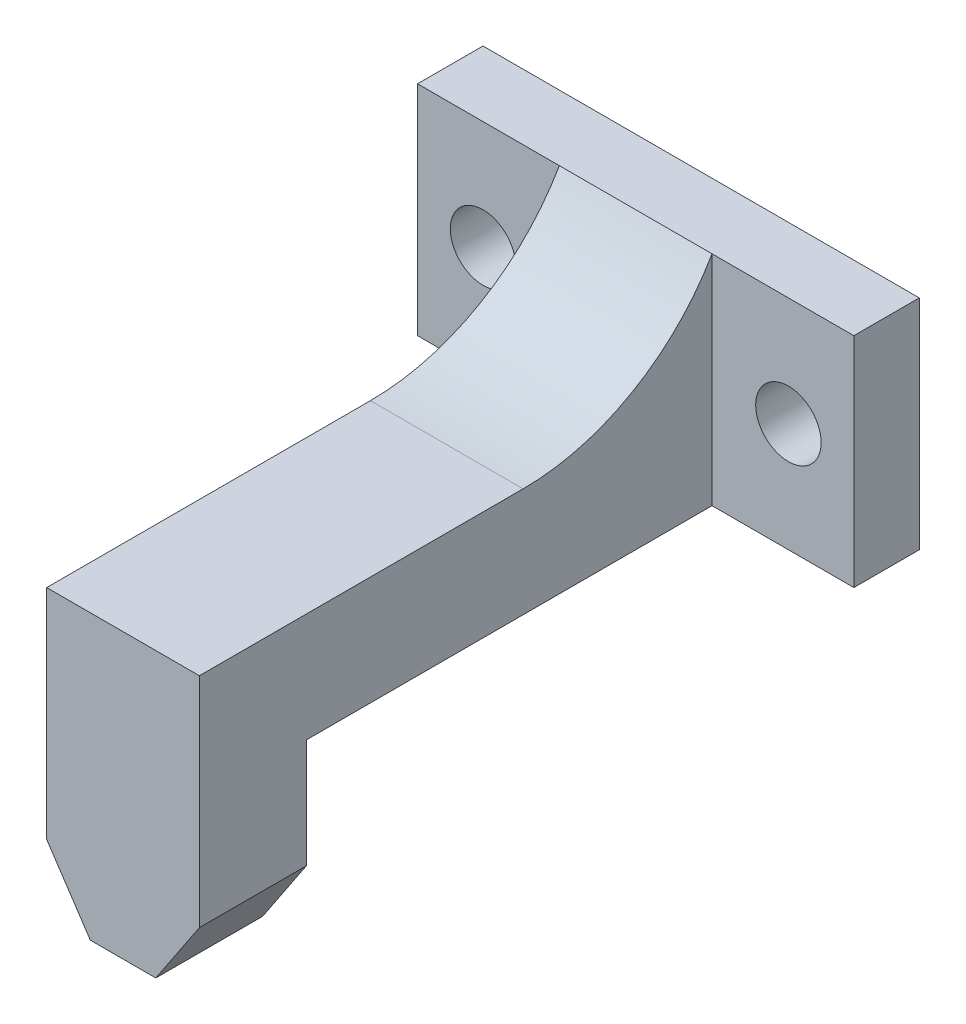
ISO-10303-21;
HEADER;
FILE_DESCRIPTION(('STEP AP214'),'2;1');
FILE_NAME('part.step','',(''),(''),'','','');
FILE_SCHEMA(('AUTOMOTIVE_DESIGN { 1 0 10303 214 1 1 1 1 }'));
ENDSEC;
DATA;
#1=APPLICATION_CONTEXT('core data for automotive mechanical design processes');
#2=APPLICATION_PROTOCOL_DEFINITION('international standard','automotive_design',2000,#1);
#3=PRODUCT_CONTEXT('',#1,'mechanical');
#4=PRODUCT('Part','Part','',(#3));
#5=PRODUCT_RELATED_PRODUCT_CATEGORY('part','',(#4));
#6=PRODUCT_DEFINITION_FORMATION('','',#4);
#7=PRODUCT_DEFINITION_CONTEXT('part definition',#1,'design');
#8=PRODUCT_DEFINITION('design','',#6,#7);
#9=PRODUCT_DEFINITION_SHAPE('','',#8);
#10=(LENGTH_UNIT() NAMED_UNIT(*) SI_UNIT(.MILLI.,.METRE.));
#11=(NAMED_UNIT(*) PLANE_ANGLE_UNIT() SI_UNIT($,.RADIAN.));
#12=(NAMED_UNIT(*) SI_UNIT($,.STERADIAN.) SOLID_ANGLE_UNIT());
#13=UNCERTAINTY_MEASURE_WITH_UNIT(LENGTH_MEASURE(1.E-05),#10,'distance_accuracy_value','');
#14=(GEOMETRIC_REPRESENTATION_CONTEXT(3) GLOBAL_UNCERTAINTY_ASSIGNED_CONTEXT((#13)) GLOBAL_UNIT_ASSIGNED_CONTEXT((#10,
#11,#12)) REPRESENTATION_CONTEXT('',''));
#15=CARTESIAN_POINT('',(0.,0.,0.));
#16=DIRECTION('',(0.,0.,1.));
#17=DIRECTION('',(1.,0.,0.));
#18=AXIS2_PLACEMENT_3D('',#15,#16,#17);
#19=CARTESIAN_POINT('',(0.,0.,-21.));
#20=DIRECTION('',(0.,0.,1.));
#21=DIRECTION('',(1.,0.,0.));
#22=AXIS2_PLACEMENT_3D('',#19,#20,#21);
#23=PLANE('',#22);
#24=CARTESIAN_POINT('',(7.,13.,-21.));
#25=DIRECTION('',(0.,0.,1.));
#26=DIRECTION('',(1.,0.,0.));
#27=AXIS2_PLACEMENT_3D('',#24,#25,#26);
#28=CIRCLE('',#27,1.5);
#29=CARTESIAN_POINT('',(8.5,13.,-21.));
#30=VERTEX_POINT('',#29);
#31=EDGE_CURVE('E180',#30,#30,#28,.T.);
#32=ORIENTED_EDGE('',*,*,#31,.F.);
#33=EDGE_LOOP('',(#32));
#34=FACE_BOUND('',#33,.T.);
#35=DIRECTION('',(1.,0.,0.));
#36=VECTOR('',#35,1.);
#37=CARTESIAN_POINT('',(10.,18.,-21.));
#38=LINE('',#37,#36);
#39=CARTESIAN_POINT('',(3.5,18.,-21.));
#40=VERTEX_POINT('',#39);
#41=CARTESIAN_POINT('',(10.,18.,-21.));
#42=VERTEX_POINT('',#41);
#43=EDGE_CURVE('E185',#40,#42,#38,.T.);
#44=ORIENTED_EDGE('',*,*,#43,.F.);
#45=DIRECTION('',(0.,-1.,0.));
#46=VECTOR('',#45,1.);
#47=CARTESIAN_POINT('',(3.5,13.,-21.));
#48=LINE('',#47,#46);
#49=CARTESIAN_POINT('',(3.5,8.,-21.));
#50=VERTEX_POINT('',#49);
#51=EDGE_CURVE('E200',#40,#50,#48,.T.);
#52=ORIENTED_EDGE('',*,*,#51,.T.);
#53=DIRECTION('',(-1.,0.,0.));
#54=VECTOR('',#53,1.);
#55=CARTESIAN_POINT('',(10.,8.,-21.));
#56=LINE('',#55,#54);
#57=CARTESIAN_POINT('',(10.,8.,-21.));
#58=VERTEX_POINT('',#57);
#59=EDGE_CURVE('E181',#58,#50,#56,.T.);
#60=ORIENTED_EDGE('',*,*,#59,.F.);
#61=DIRECTION('',(0.,-1.,0.));
#62=VECTOR('',#61,1.);
#63=CARTESIAN_POINT('',(10.,8.,-21.));
#64=LINE('',#63,#62);
#65=EDGE_CURVE('E176',#42,#58,#64,.T.);
#66=ORIENTED_EDGE('',*,*,#65,.F.);
#67=EDGE_LOOP('',(#44,#52,#60,#66));
#68=FACE_BOUND('',#67,.T.);
#69=ADVANCED_FACE('F34',(#34,#68),#23,.T.);
#70=CARTESIAN_POINT('',(3.5,13.,-2.5));
#71=DIRECTION('',(-1.,0.,0.));
#72=DIRECTION('',(0.,0.,1.));
#73=AXIS2_PLACEMENT_3D('',#70,#71,#72);
#74=PLANE('',#73);
#75=DIRECTION('',(0.,-1.,0.));
#76=VECTOR('',#75,1.);
#77=CARTESIAN_POINT('',(3.5,13.,2.5));
#78=LINE('',#77,#76);
#79=CARTESIAN_POINT('',(3.5,13.,2.5));
#80=VERTEX_POINT('',#79);
#81=CARTESIAN_POINT('',(3.5,3.00000000000002,2.5));
#82=VERTEX_POINT('',#81);
#83=EDGE_CURVE('E213',#80,#82,#78,.T.);
#84=ORIENTED_EDGE('',*,*,#83,.T.);
#85=DIRECTION('',(0.,0.,-1.));
#86=VECTOR('',#85,1.);
#87=CARTESIAN_POINT('',(3.5,3.00000000000002,-2.5));
#88=LINE('',#87,#86);
#89=CARTESIAN_POINT('',(3.5,3.00000000000002,-2.4));
#90=VERTEX_POINT('',#89);
#91=EDGE_CURVE('E230',#82,#90,#88,.T.);
#92=ORIENTED_EDGE('',*,*,#91,.T.);
#93=DIRECTION('',(0.,-1.,0.));
#94=VECTOR('',#93,1.);
#95=CARTESIAN_POINT('',(3.5,0.,-2.4));
#96=LINE('',#95,#94);
#97=CARTESIAN_POINT('',(3.5,8.,-2.4));
#98=VERTEX_POINT('',#97);
#99=EDGE_CURVE('E250',#98,#90,#96,.T.);
#100=ORIENTED_EDGE('',*,*,#99,.F.);
#101=DIRECTION('',(0.,0.,1.));
#102=VECTOR('',#101,1.);
#103=CARTESIAN_POINT('',(3.5,8.,-21.));
#104=LINE('',#103,#102);
#105=EDGE_CURVE('E151',#50,#98,#104,.T.);
#106=ORIENTED_EDGE('',*,*,#105,.F.);
#107=ORIENTED_EDGE('',*,*,#51,.F.);
#108=CARTESIAN_POINT('',(3.5,23.,-12.3397459621556));
#109=DIRECTION('',(-1.,0.,0.));
#110=DIRECTION('',(0.,0.,1.));
#111=AXIS2_PLACEMENT_3D('',#108,#109,#110);
#112=CIRCLE('',#111,10.);
#113=CARTESIAN_POINT('',(3.5,13.,-12.3397459621556));
#114=VERTEX_POINT('',#113);
#115=EDGE_CURVE('E226',#40,#114,#112,.T.);
#116=ORIENTED_EDGE('',*,*,#115,.T.);
#117=DIRECTION('',(0.,0.,-1.));
#118=VECTOR('',#117,1.);
#119=CARTESIAN_POINT('',(3.5,13.,-2.5));
#120=LINE('',#119,#118);
#121=EDGE_CURVE('E206',#80,#114,#120,.T.);
#122=ORIENTED_EDGE('',*,*,#121,.F.);
#123=EDGE_LOOP('',(#84,#92,#100,#106,#107,#116,#122));
#124=FACE_BOUND('',#123,.T.);
#125=ADVANCED_FACE('F248',(#124),#74,.F.);
#126=CARTESIAN_POINT('',(-3.5,13.,-2.5));
#127=DIRECTION('',(1.,0.,0.));
#128=DIRECTION('',(0.,0.,-1.));
#129=AXIS2_PLACEMENT_3D('',#126,#127,#128);
#130=PLANE('',#129);
#131=DIRECTION('',(0.,1.,0.));
#132=VECTOR('',#131,1.);
#133=CARTESIAN_POINT('',(-3.5,0.,-2.4));
#134=LINE('',#133,#132);
#135=CARTESIAN_POINT('',(-3.5,3.00000000000002,-2.4));
#136=VERTEX_POINT('',#135);
#137=CARTESIAN_POINT('',(-3.5,8.,-2.4));
#138=VERTEX_POINT('',#137);
#139=EDGE_CURVE('E131',#136,#138,#134,.T.);
#140=ORIENTED_EDGE('',*,*,#139,.F.);
#141=DIRECTION('',(0.,0.,1.));
#142=VECTOR('',#141,1.);
#143=CARTESIAN_POINT('',(-3.5,3.00000000000002,-2.5));
#144=LINE('',#143,#142);
#145=CARTESIAN_POINT('',(-3.5,3.00000000000002,2.5));
#146=VERTEX_POINT('',#145);
#147=EDGE_CURVE('E11',#136,#146,#144,.T.);
#148=ORIENTED_EDGE('',*,*,#147,.T.);
#149=DIRECTION('',(0.,-1.,0.));
#150=VECTOR('',#149,1.);
#151=CARTESIAN_POINT('',(-3.5,13.,2.5));
#152=LINE('',#151,#150);
#153=CARTESIAN_POINT('',(-3.5,13.,2.5));
#154=VERTEX_POINT('',#153);
#155=EDGE_CURVE('E217',#154,#146,#152,.T.);
#156=ORIENTED_EDGE('',*,*,#155,.F.);
#157=DIRECTION('',(0.,0.,1.));
#158=VECTOR('',#157,1.);
#159=CARTESIAN_POINT('',(-3.5,13.,-2.5));
#160=LINE('',#159,#158);
#161=CARTESIAN_POINT('',(-3.5,13.,-12.3397459621556));
#162=VERTEX_POINT('',#161);
#163=EDGE_CURVE('E209',#162,#154,#160,.T.);
#164=ORIENTED_EDGE('',*,*,#163,.F.);
#165=CARTESIAN_POINT('',(-3.5,23.,-12.3397459621556));
#166=DIRECTION('',(1.,0.,0.));
#167=DIRECTION('',(0.,0.,-1.));
#168=AXIS2_PLACEMENT_3D('',#165,#166,#167);
#169=CIRCLE('',#168,10.);
#170=CARTESIAN_POINT('',(-3.5,18.,-21.));
#171=VERTEX_POINT('',#170);
#172=EDGE_CURVE('E228',#162,#171,#169,.T.);
#173=ORIENTED_EDGE('',*,*,#172,.T.);
#174=DIRECTION('',(0.,1.,0.));
#175=VECTOR('',#174,1.);
#176=CARTESIAN_POINT('',(-3.5,13.,-21.));
#177=LINE('',#176,#175);
#178=CARTESIAN_POINT('',(-3.5,8.,-21.));
#179=VERTEX_POINT('',#178);
#180=EDGE_CURVE('E148',#179,#171,#177,.T.);
#181=ORIENTED_EDGE('',*,*,#180,.F.);
#182=DIRECTION('',(0.,0.,1.));
#183=VECTOR('',#182,1.);
#184=CARTESIAN_POINT('',(-3.5,8.,-21.));
#185=LINE('',#184,#183);
#186=EDGE_CURVE('E145',#179,#138,#185,.T.);
#187=ORIENTED_EDGE('',*,*,#186,.T.);
#188=EDGE_LOOP('',(#140,#148,#156,#164,#173,#181,#187));
#189=FACE_BOUND('',#188,.T.);
#190=ADVANCED_FACE('F146',(#189),#130,.F.);
#191=CARTESIAN_POINT('',(-3.5,13.,2.5));
#192=DIRECTION('',(0.,0.,-1.));
#193=DIRECTION('',(-1.,0.,0.));
#194=AXIS2_PLACEMENT_3D('',#191,#192,#193);
#195=PLANE('',#194);
#196=DIRECTION('',(1.,0.,0.));
#197=VECTOR('',#196,1.);
#198=CARTESIAN_POINT('',(-3.5,0.,2.5));
#199=LINE('',#198,#197);
#200=CARTESIAN_POINT('',(-1.49999999999999,0.,2.5));
#201=VERTEX_POINT('',#200);
#202=CARTESIAN_POINT('',(1.5,0.,2.5));
#203=VERTEX_POINT('',#202);
#204=EDGE_CURVE('E205',#201,#203,#199,.T.);
#205=ORIENTED_EDGE('',*,*,#204,.T.);
#206=DIRECTION('',(-0.554700196225228,-0.832050294337844,0.));
#207=VECTOR('',#206,1.);
#208=CARTESIAN_POINT('',(3.5,3.00000000000002,2.5));
#209=LINE('',#208,#207);
#210=EDGE_CURVE('E42',#203,#82,#209,.F.);
#211=ORIENTED_EDGE('',*,*,#210,.T.);
#212=ORIENTED_EDGE('',*,*,#83,.F.);
#213=DIRECTION('',(1.,0.,0.));
#214=VECTOR('',#213,1.);
#215=CARTESIAN_POINT('',(-3.5,13.,2.5));
#216=LINE('',#215,#214);
#217=EDGE_CURVE('E211',#154,#80,#216,.T.);
#218=ORIENTED_EDGE('',*,*,#217,.F.);
#219=ORIENTED_EDGE('',*,*,#155,.T.);
#220=DIRECTION('',(-0.554700196225228,0.832050294337844,0.));
#221=VECTOR('',#220,1.);
#222=CARTESIAN_POINT('',(-3.5,3.00000000000002,2.5));
#223=LINE('',#222,#221);
#224=EDGE_CURVE('E49',#146,#201,#223,.F.);
#225=ORIENTED_EDGE('',*,*,#224,.T.);
#226=EDGE_LOOP('',(#205,#211,#212,#218,#219,#225));
#227=FACE_BOUND('',#226,.T.);
#228=ADVANCED_FACE('F242',(#227),#195,.F.);
#229=CARTESIAN_POINT('',(0.,13.,0.));
#230=DIRECTION('',(0.,1.,0.));
#231=DIRECTION('',(0.,0.,1.));
#232=AXIS2_PLACEMENT_3D('',#229,#230,#231);
#233=PLANE('',#232);
#234=ORIENTED_EDGE('',*,*,#121,.T.);
#235=DIRECTION('',(-1.,0.,0.));
#236=VECTOR('',#235,1.);
#237=CARTESIAN_POINT('',(-3.5,13.,-12.3397459621556));
#238=LINE('',#237,#236);
#239=EDGE_CURVE('E220',#114,#162,#238,.T.);
#240=ORIENTED_EDGE('',*,*,#239,.T.);
#241=ORIENTED_EDGE('',*,*,#163,.T.);
#242=ORIENTED_EDGE('',*,*,#217,.T.);
#243=EDGE_LOOP('',(#234,#240,#241,#242));
#244=FACE_BOUND('',#243,.T.);
#245=ADVANCED_FACE('F256',(#244),#233,.T.);
#246=CARTESIAN_POINT('',(0.,0.,0.));
#247=DIRECTION('',(0.,1.,0.));
#248=DIRECTION('',(0.,0.,1.));
#249=AXIS2_PLACEMENT_3D('',#246,#247,#248);
#250=PLANE('',#249);
#251=DIRECTION('',(-1.,0.,0.));
#252=VECTOR('',#251,1.);
#253=CARTESIAN_POINT('',(3.5,0.,-2.4));
#254=LINE('',#253,#252);
#255=CARTESIAN_POINT('',(1.49999999999999,0.,-2.4));
#256=VERTEX_POINT('',#255);
#257=CARTESIAN_POINT('',(-1.49999999999999,0.,-2.4));
#258=VERTEX_POINT('',#257);
#259=EDGE_CURVE('E142',#256,#258,#254,.T.);
#260=ORIENTED_EDGE('',*,*,#259,.F.);
#261=DIRECTION('',(0.,0.,1.));
#262=VECTOR('',#261,1.);
#263=CARTESIAN_POINT('',(1.49999999999999,0.,0.));
#264=LINE('',#263,#262);
#265=EDGE_CURVE('E56',#256,#203,#264,.T.);
#266=ORIENTED_EDGE('',*,*,#265,.T.);
#267=ORIENTED_EDGE('',*,*,#204,.F.);
#268=DIRECTION('',(0.,0.,-1.));
#269=VECTOR('',#268,1.);
#270=CARTESIAN_POINT('',(-1.49999999999999,0.,0.));
#271=LINE('',#270,#269);
#272=EDGE_CURVE('E236',#201,#258,#271,.T.);
#273=ORIENTED_EDGE('',*,*,#272,.T.);
#274=EDGE_LOOP('',(#260,#266,#267,#273));
#275=FACE_BOUND('',#274,.T.);
#276=ADVANCED_FACE('F251',(#275),#250,.F.);
#277=CARTESIAN_POINT('',(3.5,8.,-21.));
#278=DIRECTION('',(0.,1.,0.));
#279=DIRECTION('',(-1.,0.,0.));
#280=AXIS2_PLACEMENT_3D('',#277,#278,#279);
#281=PLANE('',#280);
#282=ORIENTED_EDGE('',*,*,#105,.T.);
#283=DIRECTION('',(1.,0.,0.));
#284=VECTOR('',#283,1.);
#285=CARTESIAN_POINT('',(3.5,8.,-2.4));
#286=LINE('',#285,#284);
#287=EDGE_CURVE('E136',#138,#98,#286,.T.);
#288=ORIENTED_EDGE('',*,*,#287,.F.);
#289=ORIENTED_EDGE('',*,*,#186,.F.);
#290=CARTESIAN_POINT('',(-10.,8.,-21.));
#291=VERTEX_POINT('',#290);
#292=EDGE_CURVE('E179',#179,#291,#56,.T.);
#293=ORIENTED_EDGE('',*,*,#292,.T.);
#294=DIRECTION('',(0.,0.,1.));
#295=VECTOR('',#294,1.);
#296=CARTESIAN_POINT('',(-10.,8.,-24.));
#297=LINE('',#296,#295);
#298=CARTESIAN_POINT('',(-10.,8.,-24.));
#299=VERTEX_POINT('',#298);
#300=EDGE_CURVE('E194',#299,#291,#297,.T.);
#301=ORIENTED_EDGE('',*,*,#300,.F.);
#302=DIRECTION('',(-1.,0.,0.));
#303=VECTOR('',#302,1.);
#304=CARTESIAN_POINT('',(10.,8.,-24.));
#305=LINE('',#304,#303);
#306=CARTESIAN_POINT('',(10.,8.,-24.));
#307=VERTEX_POINT('',#306);
#308=EDGE_CURVE('E168',#307,#299,#305,.T.);
#309=ORIENTED_EDGE('',*,*,#308,.F.);
#310=DIRECTION('',(0.,0.,1.));
#311=VECTOR('',#310,1.);
#312=CARTESIAN_POINT('',(10.,8.,-24.));
#313=LINE('',#312,#311);
#314=EDGE_CURVE('E197',#307,#58,#313,.T.);
#315=ORIENTED_EDGE('',*,*,#314,.T.);
#316=ORIENTED_EDGE('',*,*,#59,.T.);
#317=EDGE_LOOP('',(#282,#288,#289,#293,#301,#309,#315,#316));
#318=FACE_BOUND('',#317,.T.);
#319=ADVANCED_FACE('F153',(#318),#281,.F.);
#320=CARTESIAN_POINT('',(10.,8.,-24.));
#321=DIRECTION('',(-1.,0.,0.));
#322=DIRECTION('',(0.,0.,1.));
#323=AXIS2_PLACEMENT_3D('',#320,#321,#322);
#324=PLANE('',#323);
#325=ORIENTED_EDGE('',*,*,#65,.T.);
#326=ORIENTED_EDGE('',*,*,#314,.F.);
#327=DIRECTION('',(0.,-1.,0.));
#328=VECTOR('',#327,1.);
#329=CARTESIAN_POINT('',(10.,8.,-24.));
#330=LINE('',#329,#328);
#331=CARTESIAN_POINT('',(10.,18.,-24.));
#332=VERTEX_POINT('',#331);
#333=EDGE_CURVE('E165',#332,#307,#330,.T.);
#334=ORIENTED_EDGE('',*,*,#333,.F.);
#335=DIRECTION('',(0.,0.,1.));
#336=VECTOR('',#335,1.);
#337=CARTESIAN_POINT('',(10.,18.,-24.));
#338=LINE('',#337,#336);
#339=EDGE_CURVE('E175',#332,#42,#338,.T.);
#340=ORIENTED_EDGE('',*,*,#339,.T.);
#341=EDGE_LOOP('',(#325,#326,#334,#340));
#342=FACE_BOUND('',#341,.T.);
#343=ADVANCED_FACE('F273',(#342),#324,.F.);
#344=CARTESIAN_POINT('',(-10.,8.,-24.));
#345=DIRECTION('',(1.,0.,0.));
#346=DIRECTION('',(0.,0.,-1.));
#347=AXIS2_PLACEMENT_3D('',#344,#345,#346);
#348=PLANE('',#347);
#349=DIRECTION('',(0.,1.,0.));
#350=VECTOR('',#349,1.);
#351=CARTESIAN_POINT('',(-10.,8.,-21.));
#352=LINE('',#351,#350);
#353=CARTESIAN_POINT('',(-10.,18.,-21.));
#354=VERTEX_POINT('',#353);
#355=EDGE_CURVE('E183',#291,#354,#352,.T.);
#356=ORIENTED_EDGE('',*,*,#355,.T.);
#357=DIRECTION('',(0.,0.,1.));
#358=VECTOR('',#357,1.);
#359=CARTESIAN_POINT('',(-10.,18.,-24.));
#360=LINE('',#359,#358);
#361=CARTESIAN_POINT('',(-10.,18.,-24.));
#362=VERTEX_POINT('',#361);
#363=EDGE_CURVE('E191',#362,#354,#360,.T.);
#364=ORIENTED_EDGE('',*,*,#363,.F.);
#365=DIRECTION('',(0.,1.,0.));
#366=VECTOR('',#365,1.);
#367=CARTESIAN_POINT('',(-10.,8.,-24.));
#368=LINE('',#367,#366);
#369=EDGE_CURVE('E171',#299,#362,#368,.T.);
#370=ORIENTED_EDGE('',*,*,#369,.F.);
#371=ORIENTED_EDGE('',*,*,#300,.T.);
#372=EDGE_LOOP('',(#356,#364,#370,#371));
#373=FACE_BOUND('',#372,.T.);
#374=ADVANCED_FACE('F285',(#373),#348,.F.);
#375=CARTESIAN_POINT('',(10.,18.,-24.));
#376=DIRECTION('',(0.,-1.,0.));
#377=DIRECTION('',(0.,0.,-1.));
#378=AXIS2_PLACEMENT_3D('',#375,#376,#377);
#379=PLANE('',#378);
#380=EDGE_CURVE('E169',#354,#171,#38,.T.);
#381=ORIENTED_EDGE('',*,*,#380,.T.);
#382=EDGE_CURVE('E188',#171,#40,#38,.T.);
#383=ORIENTED_EDGE('',*,*,#382,.T.);
#384=ORIENTED_EDGE('',*,*,#43,.T.);
#385=ORIENTED_EDGE('',*,*,#339,.F.);
#386=DIRECTION('',(1.,0.,0.));
#387=VECTOR('',#386,1.);
#388=CARTESIAN_POINT('',(10.,18.,-24.));
#389=LINE('',#388,#387);
#390=EDGE_CURVE('E173',#362,#332,#389,.T.);
#391=ORIENTED_EDGE('',*,*,#390,.F.);
#392=ORIENTED_EDGE('',*,*,#363,.T.);
#393=EDGE_LOOP('',(#381,#383,#384,#385,#391,#392));
#394=FACE_BOUND('',#393,.T.);
#395=ADVANCED_FACE('F267',(#394),#379,.F.);
#396=CARTESIAN_POINT('',(0.,0.,-24.));
#397=DIRECTION('',(0.,0.,1.));
#398=DIRECTION('',(1.,0.,0.));
#399=AXIS2_PLACEMENT_3D('',#396,#397,#398);
#400=PLANE('',#399);
#401=CARTESIAN_POINT('',(7.,13.,-24.));
#402=DIRECTION('',(0.,0.,-1.));
#403=DIRECTION('',(-1.,0.,0.));
#404=AXIS2_PLACEMENT_3D('',#401,#402,#403);
#405=CIRCLE('',#404,1.5);
#406=CARTESIAN_POINT('',(5.5,13.,-24.));
#407=VERTEX_POINT('',#406);
#408=EDGE_CURVE('E158',#407,#407,#405,.T.);
#409=ORIENTED_EDGE('',*,*,#408,.F.);
#410=EDGE_LOOP('',(#409));
#411=FACE_BOUND('',#410,.T.);
#412=CARTESIAN_POINT('',(-7.,13.,-24.));
#413=DIRECTION('',(0.,0.,-1.));
#414=DIRECTION('',(-1.,0.,0.));
#415=AXIS2_PLACEMENT_3D('',#412,#413,#414);
#416=CIRCLE('',#415,1.5);
#417=CARTESIAN_POINT('',(-8.5,13.,-24.));
#418=VERTEX_POINT('',#417);
#419=EDGE_CURVE('E155',#418,#418,#416,.T.);
#420=ORIENTED_EDGE('',*,*,#419,.F.);
#421=EDGE_LOOP('',(#420));
#422=FACE_BOUND('',#421,.T.);
#423=ORIENTED_EDGE('',*,*,#333,.T.);
#424=ORIENTED_EDGE('',*,*,#308,.T.);
#425=ORIENTED_EDGE('',*,*,#369,.T.);
#426=ORIENTED_EDGE('',*,*,#390,.T.);
#427=EDGE_LOOP('',(#423,#424,#425,#426));
#428=FACE_BOUND('',#427,.T.);
#429=ADVANCED_FACE('F278',(#411,#422,#428),#400,.F.);
#430=CARTESIAN_POINT('',(-7.,13.,-21.));
#431=DIRECTION('',(0.,0.,1.));
#432=DIRECTION('',(1.,0.,0.));
#433=AXIS2_PLACEMENT_3D('',#430,#431,#432);
#434=CIRCLE('',#433,1.5);
#435=CARTESIAN_POINT('',(-5.5,13.,-21.));
#436=VERTEX_POINT('',#435);
#437=EDGE_CURVE('E163',#436,#436,#434,.T.);
#438=ORIENTED_EDGE('',*,*,#437,.F.);
#439=EDGE_LOOP('',(#438));
#440=FACE_BOUND('',#439,.T.);
#441=ORIENTED_EDGE('',*,*,#180,.T.);
#442=ORIENTED_EDGE('',*,*,#380,.F.);
#443=ORIENTED_EDGE('',*,*,#355,.F.);
#444=ORIENTED_EDGE('',*,*,#292,.F.);
#445=EDGE_LOOP('',(#441,#442,#443,#444));
#446=FACE_BOUND('',#445,.T.);
#447=ADVANCED_FACE('F284',(#440,#446),#23,.T.);
#448=CARTESIAN_POINT('',(-7.,13.,2.5));
#449=DIRECTION('',(0.,0.,-1.));
#450=DIRECTION('',(-1.,0.,0.));
#451=AXIS2_PLACEMENT_3D('',#448,#449,#450);
#452=CYLINDRICAL_SURFACE('',#451,1.5);
#453=ORIENTED_EDGE('',*,*,#437,.T.);
#454=EDGE_LOOP('',(#453));
#455=FACE_BOUND('',#454,.T.);
#456=ORIENTED_EDGE('',*,*,#419,.T.);
#457=EDGE_LOOP('',(#456));
#458=FACE_BOUND('',#457,.T.);
#459=ADVANCED_FACE('F304',(#455,#458),#452,.F.);
#460=CARTESIAN_POINT('',(7.,13.,2.5));
#461=DIRECTION('',(0.,0.,-1.));
#462=DIRECTION('',(-1.,0.,0.));
#463=AXIS2_PLACEMENT_3D('',#460,#461,#462);
#464=CYLINDRICAL_SURFACE('',#463,1.5);
#465=ORIENTED_EDGE('',*,*,#31,.T.);
#466=EDGE_LOOP('',(#465));
#467=FACE_BOUND('',#466,.T.);
#468=ORIENTED_EDGE('',*,*,#408,.T.);
#469=EDGE_LOOP('',(#468));
#470=FACE_BOUND('',#469,.T.);
#471=ADVANCED_FACE('F310',(#467,#470),#464,.F.);
#472=CARTESIAN_POINT('',(0.,23.,-12.3397459621556));
#473=DIRECTION('',(1.,0.,0.));
#474=DIRECTION('',(0.,0.,-1.));
#475=AXIS2_PLACEMENT_3D('',#472,#473,#474);
#476=CYLINDRICAL_SURFACE('',#475,10.);
#477=ORIENTED_EDGE('',*,*,#172,.F.);
#478=ORIENTED_EDGE('',*,*,#239,.F.);
#479=ORIENTED_EDGE('',*,*,#115,.F.);
#480=ORIENTED_EDGE('',*,*,#382,.F.);
#481=EDGE_LOOP('',(#477,#478,#479,#480));
#482=FACE_BOUND('',#481,.T.);
#483=ADVANCED_FACE('F261',(#482),#476,.F.);
#484=CARTESIAN_POINT('',(0.,0.,-2.4));
#485=DIRECTION('',(0.,0.,1.));
#486=DIRECTION('',(1.,0.,0.));
#487=AXIS2_PLACEMENT_3D('',#484,#485,#486);
#488=PLANE('',#487);
#489=ORIENTED_EDGE('',*,*,#99,.T.);
#490=DIRECTION('',(0.554700196225228,0.832050294337844,0.));
#491=VECTOR('',#490,1.);
#492=CARTESIAN_POINT('',(3.5,3.00000000000002,-2.4));
#493=LINE('',#492,#491);
#494=EDGE_CURVE('E234',#90,#256,#493,.F.);
#495=ORIENTED_EDGE('',*,*,#494,.T.);
#496=ORIENTED_EDGE('',*,*,#259,.T.);
#497=DIRECTION('',(0.554700196225228,-0.832050294337844,0.));
#498=VECTOR('',#497,1.);
#499=CARTESIAN_POINT('',(-3.5,3.00000000000002,-2.4));
#500=LINE('',#499,#498);
#501=EDGE_CURVE('E140',#258,#136,#500,.F.);
#502=ORIENTED_EDGE('',*,*,#501,.T.);
#503=ORIENTED_EDGE('',*,*,#139,.T.);
#504=ORIENTED_EDGE('',*,*,#287,.T.);
#505=EDGE_LOOP('',(#489,#495,#496,#502,#503,#504));
#506=FACE_BOUND('',#505,.T.);
#507=ADVANCED_FACE('F134',(#506),#488,.F.);
#508=CARTESIAN_POINT('',(3.5,3.00000000000002,-2.5));
#509=DIRECTION('',(-0.832050294337844,0.554700196225228,0.));
#510=DIRECTION('',(0.,0.,-1.));
#511=AXIS2_PLACEMENT_3D('',#508,#509,#510);
#512=PLANE('',#511);
#513=ORIENTED_EDGE('',*,*,#210,.F.);
#514=ORIENTED_EDGE('',*,*,#265,.F.);
#515=ORIENTED_EDGE('',*,*,#494,.F.);
#516=ORIENTED_EDGE('',*,*,#91,.F.);
#517=EDGE_LOOP('',(#513,#514,#515,#516));
#518=FACE_BOUND('',#517,.T.);
#519=ADVANCED_FACE('F249',(#518),#512,.F.);
#520=CARTESIAN_POINT('',(-3.5,3.00000000000002,-2.5));
#521=DIRECTION('',(0.832050294337844,0.554700196225228,0.));
#522=DIRECTION('',(0.,0.,1.));
#523=AXIS2_PLACEMENT_3D('',#520,#521,#522);
#524=PLANE('',#523);
#525=ORIENTED_EDGE('',*,*,#501,.F.);
#526=ORIENTED_EDGE('',*,*,#272,.F.);
#527=ORIENTED_EDGE('',*,*,#224,.F.);
#528=ORIENTED_EDGE('',*,*,#147,.F.);
#529=EDGE_LOOP('',(#525,#526,#527,#528));
#530=FACE_BOUND('',#529,.T.);
#531=ADVANCED_FACE('F36',(#530),#524,.F.);
#532=CLOSED_SHELL('',(#69,#125,#190,#228,#245,#276,#319,#343,#374,#395,#429,#447,#459,#471,#483,
#507,#519,#531));
#533=MANIFOLD_SOLID_BREP('B2',#532);
#534=ADVANCED_BREP_SHAPE_REPRESENTATION('',(#18,#533),#14);
#535=SHAPE_DEFINITION_REPRESENTATION(#9,#534);
ENDSEC;
END-ISO-10303-21;
